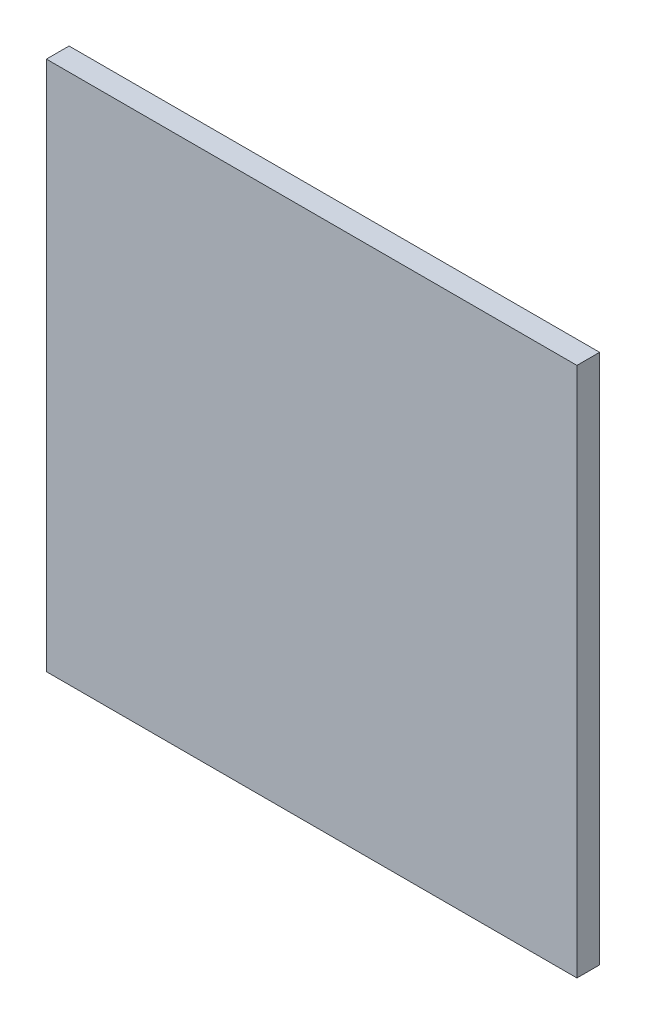
ISO-10303-21;
HEADER;
FILE_DESCRIPTION(('STEP AP214'),'2;1');
FILE_NAME('part.step','',(''),(''),'','','');
FILE_SCHEMA(('AUTOMOTIVE_DESIGN { 1 0 10303 214 1 1 1 1 }'));
ENDSEC;
DATA;
#1=APPLICATION_CONTEXT('core data for automotive mechanical design processes');
#2=APPLICATION_PROTOCOL_DEFINITION('international standard','automotive_design',2000,#1);
#3=PRODUCT_CONTEXT('',#1,'mechanical');
#4=PRODUCT('Part','Part','',(#3));
#5=PRODUCT_RELATED_PRODUCT_CATEGORY('part','',(#4));
#6=PRODUCT_DEFINITION_FORMATION('','',#4);
#7=PRODUCT_DEFINITION_CONTEXT('part definition',#1,'design');
#8=PRODUCT_DEFINITION('design','',#6,#7);
#9=PRODUCT_DEFINITION_SHAPE('','',#8);
#10=(LENGTH_UNIT() NAMED_UNIT(*) SI_UNIT(.MILLI.,.METRE.));
#11=(NAMED_UNIT(*) PLANE_ANGLE_UNIT() SI_UNIT($,.RADIAN.));
#12=(NAMED_UNIT(*) SI_UNIT($,.STERADIAN.) SOLID_ANGLE_UNIT());
#13=UNCERTAINTY_MEASURE_WITH_UNIT(LENGTH_MEASURE(1.E-05),#10,'distance_accuracy_value','');
#14=(GEOMETRIC_REPRESENTATION_CONTEXT(3) GLOBAL_UNCERTAINTY_ASSIGNED_CONTEXT((#13)) GLOBAL_UNIT_ASSIGNED_CONTEXT((#10,
#11,#12)) REPRESENTATION_CONTEXT('',''));
#15=CARTESIAN_POINT('',(0.,0.,0.));
#16=DIRECTION('',(0.,0.,1.));
#17=DIRECTION('',(1.,0.,0.));
#18=AXIS2_PLACEMENT_3D('',#15,#16,#17);
#19=CARTESIAN_POINT('',(0.,0.,0.5));
#20=DIRECTION('',(1.,0.,0.));
#21=DIRECTION('',(0.,1.,0.));
#22=AXIS2_PLACEMENT_3D('',#19,#20,#21);
#23=PLANE('',#22);
#24=DIRECTION('',(0.,-1.,0.));
#25=VECTOR('',#24,1.);
#26=CARTESIAN_POINT('',(0.,0.,0.));
#27=LINE('',#26,#25);
#28=CARTESIAN_POINT('',(0.,0.,0.));
#29=VERTEX_POINT('',#28);
#30=CARTESIAN_POINT('',(0.,-11.7,0.));
#31=VERTEX_POINT('',#30);
#32=EDGE_CURVE('E113',#29,#31,#27,.T.);
#33=ORIENTED_EDGE('',*,*,#32,.T.);
#34=DIRECTION('',(0.,0.,-1.));
#35=VECTOR('',#34,1.);
#36=CARTESIAN_POINT('',(0.,-11.7,0.5));
#37=LINE('',#36,#35);
#38=CARTESIAN_POINT('',(0.,-11.7,0.5));
#39=VERTEX_POINT('',#38);
#40=EDGE_CURVE('E11',#39,#31,#37,.T.);
#41=ORIENTED_EDGE('',*,*,#40,.F.);
#42=DIRECTION('',(0.,-1.,0.));
#43=VECTOR('',#42,1.);
#44=CARTESIAN_POINT('',(0.,0.,0.5));
#45=LINE('',#44,#43);
#46=CARTESIAN_POINT('',(0.,0.,0.5));
#47=VERTEX_POINT('',#46);
#48=EDGE_CURVE('E97',#47,#39,#45,.T.);
#49=ORIENTED_EDGE('',*,*,#48,.F.);
#50=DIRECTION('',(0.,0.,-1.));
#51=VECTOR('',#50,1.);
#52=CARTESIAN_POINT('',(0.,0.,0.5));
#53=LINE('',#52,#51);
#54=EDGE_CURVE('E109',#47,#29,#53,.T.);
#55=ORIENTED_EDGE('',*,*,#54,.T.);
#56=EDGE_LOOP('',(#33,#41,#49,#55));
#57=FACE_BOUND('',#56,.T.);
#58=ADVANCED_FACE('F45',(#57),#23,.F.);
#59=CARTESIAN_POINT('',(0.,-11.7,0.5));
#60=DIRECTION('',(0.,1.,0.));
#61=DIRECTION('',(0.,0.,1.));
#62=AXIS2_PLACEMENT_3D('',#59,#60,#61);
#63=PLANE('',#62);
#64=DIRECTION('',(1.,0.,0.));
#65=VECTOR('',#64,1.);
#66=CARTESIAN_POINT('',(0.,-11.7,0.));
#67=LINE('',#66,#65);
#68=CARTESIAN_POINT('',(11.7,-11.7,0.));
#69=VERTEX_POINT('',#68);
#70=EDGE_CURVE('E102',#31,#69,#67,.T.);
#71=ORIENTED_EDGE('',*,*,#70,.T.);
#72=DIRECTION('',(0.,0.,-1.));
#73=VECTOR('',#72,1.);
#74=CARTESIAN_POINT('',(11.7,-11.7,0.5));
#75=LINE('',#74,#73);
#76=CARTESIAN_POINT('',(11.7,-11.7,0.5));
#77=VERTEX_POINT('',#76);
#78=EDGE_CURVE('E54',#77,#69,#75,.T.);
#79=ORIENTED_EDGE('',*,*,#78,.F.);
#80=DIRECTION('',(1.,0.,0.));
#81=VECTOR('',#80,1.);
#82=CARTESIAN_POINT('',(0.,-11.7,0.5));
#83=LINE('',#82,#81);
#84=EDGE_CURVE('E92',#39,#77,#83,.T.);
#85=ORIENTED_EDGE('',*,*,#84,.F.);
#86=ORIENTED_EDGE('',*,*,#40,.T.);
#87=EDGE_LOOP('',(#71,#79,#85,#86));
#88=FACE_BOUND('',#87,.T.);
#89=ADVANCED_FACE('F101',(#88),#63,.F.);
#90=CARTESIAN_POINT('',(11.7,0.,0.5));
#91=DIRECTION('',(-1.,0.,0.));
#92=DIRECTION('',(0.,-1.,0.));
#93=AXIS2_PLACEMENT_3D('',#90,#91,#92);
#94=PLANE('',#93);
#95=DIRECTION('',(0.,1.,0.));
#96=VECTOR('',#95,1.);
#97=CARTESIAN_POINT('',(11.7,0.,0.));
#98=LINE('',#97,#96);
#99=CARTESIAN_POINT('',(11.7,0.,0.));
#100=VERTEX_POINT('',#99);
#101=EDGE_CURVE('E79',#69,#100,#98,.T.);
#102=ORIENTED_EDGE('',*,*,#101,.T.);
#103=DIRECTION('',(0.,0.,-1.));
#104=VECTOR('',#103,1.);
#105=CARTESIAN_POINT('',(11.7,0.,0.5));
#106=LINE('',#105,#104);
#107=CARTESIAN_POINT('',(11.7,0.,0.5));
#108=VERTEX_POINT('',#107);
#109=EDGE_CURVE('E104',#108,#100,#106,.T.);
#110=ORIENTED_EDGE('',*,*,#109,.F.);
#111=DIRECTION('',(0.,1.,0.));
#112=VECTOR('',#111,1.);
#113=CARTESIAN_POINT('',(11.7,0.,0.5));
#114=LINE('',#113,#112);
#115=EDGE_CURVE('E95',#77,#108,#114,.T.);
#116=ORIENTED_EDGE('',*,*,#115,.F.);
#117=ORIENTED_EDGE('',*,*,#78,.T.);
#118=EDGE_LOOP('',(#102,#110,#116,#117));
#119=FACE_BOUND('',#118,.T.);
#120=ADVANCED_FACE('F105',(#119),#94,.F.);
#121=CARTESIAN_POINT('',(0.,0.,0.5));
#122=DIRECTION('',(0.,-1.,0.));
#123=DIRECTION('',(0.,0.,-1.));
#124=AXIS2_PLACEMENT_3D('',#121,#122,#123);
#125=PLANE('',#124);
#126=DIRECTION('',(-1.,0.,0.));
#127=VECTOR('',#126,1.);
#128=CARTESIAN_POINT('',(0.,0.,0.));
#129=LINE('',#128,#127);
#130=EDGE_CURVE('E85',#100,#29,#129,.T.);
#131=ORIENTED_EDGE('',*,*,#130,.T.);
#132=ORIENTED_EDGE('',*,*,#54,.F.);
#133=DIRECTION('',(-1.,0.,0.));
#134=VECTOR('',#133,1.);
#135=CARTESIAN_POINT('',(0.,0.,0.5));
#136=LINE('',#135,#134);
#137=EDGE_CURVE('E62',#108,#47,#136,.T.);
#138=ORIENTED_EDGE('',*,*,#137,.F.);
#139=ORIENTED_EDGE('',*,*,#109,.T.);
#140=EDGE_LOOP('',(#131,#132,#138,#139));
#141=FACE_BOUND('',#140,.T.);
#142=ADVANCED_FACE('F126',(#141),#125,.F.);
#143=CARTESIAN_POINT('',(0.,0.,0.5));
#144=DIRECTION('',(0.,0.,1.));
#145=DIRECTION('',(1.,0.,0.));
#146=AXIS2_PLACEMENT_3D('',#143,#144,#145);
#147=PLANE('',#146);
#148=ORIENTED_EDGE('',*,*,#48,.T.);
#149=ORIENTED_EDGE('',*,*,#84,.T.);
#150=ORIENTED_EDGE('',*,*,#115,.T.);
#151=ORIENTED_EDGE('',*,*,#137,.T.);
#152=EDGE_LOOP('',(#148,#149,#150,#151));
#153=FACE_BOUND('',#152,.T.);
#154=ADVANCED_FACE('F93',(#153),#147,.T.);
#155=CARTESIAN_POINT('',(0.,0.,0.));
#156=DIRECTION('',(0.,0.,1.));
#157=DIRECTION('',(1.,0.,0.));
#158=AXIS2_PLACEMENT_3D('',#155,#156,#157);
#159=PLANE('',#158);
#160=ORIENTED_EDGE('',*,*,#32,.F.);
#161=ORIENTED_EDGE('',*,*,#130,.F.);
#162=ORIENTED_EDGE('',*,*,#101,.F.);
#163=ORIENTED_EDGE('',*,*,#70,.F.);
#164=EDGE_LOOP('',(#160,#161,#162,#163));
#165=FACE_BOUND('',#164,.T.);
#166=ADVANCED_FACE('F129',(#165),#159,.F.);
#167=CLOSED_SHELL('',(#58,#89,#120,#142,#154,#166));
#168=MANIFOLD_SOLID_BREP('B2',#167);
#169=ADVANCED_BREP_SHAPE_REPRESENTATION('',(#18,#168),#14);
#170=SHAPE_DEFINITION_REPRESENTATION(#9,#169);
ENDSEC;
END-ISO-10303-21;
